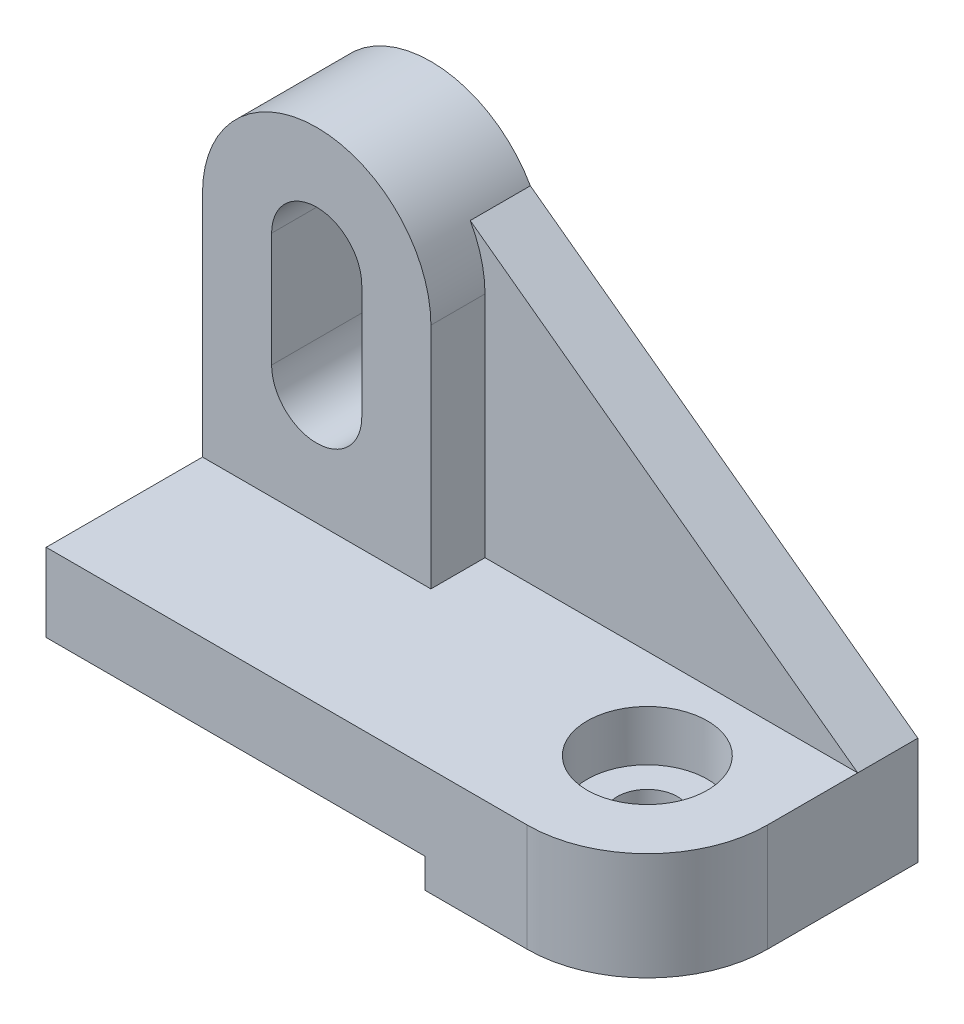
ISO-10303-21;
HEADER;
FILE_DESCRIPTION(('STEP AP214'),'2;1');
FILE_NAME('part.step','',(''),(''),'','','');
FILE_SCHEMA(('AUTOMOTIVE_DESIGN { 1 0 10303 214 1 1 1 1 }'));
ENDSEC;
DATA;
#1=APPLICATION_CONTEXT('core data for automotive mechanical design processes');
#2=APPLICATION_PROTOCOL_DEFINITION('international standard','automotive_design',2000,#1);
#3=PRODUCT_CONTEXT('',#1,'mechanical');
#4=PRODUCT('Part','Part','',(#3));
#5=PRODUCT_RELATED_PRODUCT_CATEGORY('part','',(#4));
#6=PRODUCT_DEFINITION_FORMATION('','',#4);
#7=PRODUCT_DEFINITION_CONTEXT('part definition',#1,'design');
#8=PRODUCT_DEFINITION('design','',#6,#7);
#9=PRODUCT_DEFINITION_SHAPE('','',#8);
#10=(LENGTH_UNIT() NAMED_UNIT(*) SI_UNIT(.MILLI.,.METRE.));
#11=(NAMED_UNIT(*) PLANE_ANGLE_UNIT() SI_UNIT($,.RADIAN.));
#12=(NAMED_UNIT(*) SI_UNIT($,.STERADIAN.) SOLID_ANGLE_UNIT());
#13=UNCERTAINTY_MEASURE_WITH_UNIT(LENGTH_MEASURE(1.E-05),#10,'distance_accuracy_value','');
#14=(GEOMETRIC_REPRESENTATION_CONTEXT(3) GLOBAL_UNCERTAINTY_ASSIGNED_CONTEXT((#13)) GLOBAL_UNIT_ASSIGNED_CONTEXT((#10,
#11,#12)) REPRESENTATION_CONTEXT('',''));
#15=CARTESIAN_POINT('',(0.,0.,0.));
#16=DIRECTION('',(0.,0.,1.));
#17=DIRECTION('',(1.,0.,0.));
#18=AXIS2_PLACEMENT_3D('',#15,#16,#17);
#19=CARTESIAN_POINT('',(26.127941661392,-4.90948585690516,-20.));
#20=DIRECTION('',(0.,1.,0.));
#21=DIRECTION('',(0.,0.,1.));
#22=AXIS2_PLACEMENT_3D('',#19,#20,#21);
#23=CYLINDRICAL_SURFACE('',#22,10.);
#24=CARTESIAN_POINT('',(26.127941661392,13.,-20.));
#25=DIRECTION('',(0.,1.,0.));
#26=DIRECTION('',(0.,0.,1.));
#27=AXIS2_PLACEMENT_3D('',#24,#25,#26);
#28=CIRCLE('',#27,10.);
#29=CARTESIAN_POINT('',(26.127941661392,13.,-10.));
#30=VERTEX_POINT('',#29);
#31=EDGE_CURVE('E276',#30,#30,#28,.T.);
#32=ORIENTED_EDGE('',*,*,#31,.T.);
#33=EDGE_LOOP('',(#32));
#34=FACE_BOUND('',#33,.T.);
#35=CARTESIAN_POINT('',(26.127941661392,4.59151414309485,-20.));
#36=DIRECTION('',(0.,-1.,0.));
#37=DIRECTION('',(1.,0.,0.));
#38=AXIS2_PLACEMENT_3D('',#35,#36,#37);
#39=CIRCLE('',#38,10.);
#40=CARTESIAN_POINT('',(36.127941661392,4.59151414309484,-20.));
#41=VERTEX_POINT('',#40);
#42=EDGE_CURVE('E11',#41,#41,#39,.F.);
#43=ORIENTED_EDGE('',*,*,#42,.F.);
#44=EDGE_LOOP('',(#43));
#45=FACE_BOUND('',#44,.T.);
#46=ADVANCED_FACE('F37',(#34,#45),#23,.F.);
#47=CARTESIAN_POINT('',(-34.8720583386081,51.,-26.));
#48=DIRECTION('',(0.,0.,-1.));
#49=DIRECTION('',(-1.,0.,0.));
#50=AXIS2_PLACEMENT_3D('',#47,#48,#49);
#51=CYLINDRICAL_SURFACE('',#50,19.);
#52=CARTESIAN_POINT('',(-34.8720583386081,51.,-35.));
#53=DIRECTION('',(0.,0.,1.));
#54=DIRECTION('',(1.,0.,0.));
#55=AXIS2_PLACEMENT_3D('',#52,#53,#54);
#56=CIRCLE('',#55,19.);
#57=CARTESIAN_POINT('',(-18.3294113453158,60.3456316242039,-35.));
#58=VERTEX_POINT('',#57);
#59=CARTESIAN_POINT('',(-15.8720583386081,51.,-35.));
#60=VERTEX_POINT('',#59);
#61=EDGE_CURVE('E45',#58,#60,#56,.F.);
#62=ORIENTED_EDGE('',*,*,#61,.F.);
#63=DIRECTION('',(0.,0.,-1.));
#64=VECTOR('',#63,1.);
#65=CARTESIAN_POINT('',(-18.3294113453158,60.3456316242039,-35.));
#66=LINE('',#65,#64);
#67=CARTESIAN_POINT('',(-18.3294113453158,60.3456316242039,-45.));
#68=VERTEX_POINT('',#67);
#69=EDGE_CURVE('E159',#58,#68,#66,.T.);
#70=ORIENTED_EDGE('',*,*,#69,.T.);
#71=CARTESIAN_POINT('',(-34.8720583386081,51.,-45.));
#72=DIRECTION('',(0.,0.,-1.));
#73=DIRECTION('',(-1.,0.,0.));
#74=AXIS2_PLACEMENT_3D('',#71,#72,#73);
#75=CIRCLE('',#74,19.);
#76=CARTESIAN_POINT('',(-53.8720583386081,51.,-45.));
#77=VERTEX_POINT('',#76);
#78=EDGE_CURVE('E233',#77,#68,#75,.T.);
#79=ORIENTED_EDGE('',*,*,#78,.F.);
#80=DIRECTION('',(0.,0.,-1.));
#81=VECTOR('',#80,1.);
#82=CARTESIAN_POINT('',(-53.8720583386081,51.,-26.));
#83=LINE('',#82,#81);
#84=CARTESIAN_POINT('',(-53.8720583386081,51.,-26.));
#85=VERTEX_POINT('',#84);
#86=EDGE_CURVE('E226',#85,#77,#83,.T.);
#87=ORIENTED_EDGE('',*,*,#86,.F.);
#88=CARTESIAN_POINT('',(-34.8720583386081,51.,-26.));
#89=DIRECTION('',(0.,0.,-1.));
#90=DIRECTION('',(-1.,0.,0.));
#91=AXIS2_PLACEMENT_3D('',#88,#89,#90);
#92=CIRCLE('',#91,19.);
#93=CARTESIAN_POINT('',(-15.8720583386081,51.,-26.));
#94=VERTEX_POINT('',#93);
#95=EDGE_CURVE('E239',#85,#94,#92,.T.);
#96=ORIENTED_EDGE('',*,*,#95,.T.);
#97=DIRECTION('',(0.,0.,-1.));
#98=VECTOR('',#97,1.);
#99=CARTESIAN_POINT('',(-15.8720583386081,51.,-26.));
#100=LINE('',#99,#98);
#101=EDGE_CURVE('E170',#94,#60,#100,.T.);
#102=ORIENTED_EDGE('',*,*,#101,.T.);
#103=EDGE_LOOP('',(#62,#70,#79,#87,#96,#102));
#104=FACE_BOUND('',#103,.T.);
#105=ADVANCED_FACE('F168',(#104),#51,.T.);
#106=CARTESIAN_POINT('',(9.12794166139195,0.,-45.));
#107=DIRECTION('',(0.,-1.,0.));
#108=DIRECTION('',(1.,0.,0.));
#109=AXIS2_PLACEMENT_3D('',#106,#107,#108);
#110=PLANE('',#109);
#111=DIRECTION('',(1.,0.,0.));
#112=VECTOR('',#111,1.);
#113=CARTESIAN_POINT('',(9.12794166139195,0.,0.));
#114=LINE('',#113,#112);
#115=CARTESIAN_POINT('',(-53.872058338608,0.,0.));
#116=VERTEX_POINT('',#115);
#117=CARTESIAN_POINT('',(9.12794166139195,0.,0.));
#118=VERTEX_POINT('',#117);
#119=EDGE_CURVE('E209',#116,#118,#114,.T.);
#120=ORIENTED_EDGE('',*,*,#119,.F.);
#121=DIRECTION('',(0.,0.,1.));
#122=VECTOR('',#121,1.);
#123=CARTESIAN_POINT('',(-53.872058338608,0.,-45.));
#124=LINE('',#123,#122);
#125=CARTESIAN_POINT('',(-53.872058338608,0.,-45.));
#126=VERTEX_POINT('',#125);
#127=EDGE_CURVE('E181',#126,#116,#124,.T.);
#128=ORIENTED_EDGE('',*,*,#127,.F.);
#129=DIRECTION('',(1.,0.,0.));
#130=VECTOR('',#129,1.);
#131=CARTESIAN_POINT('',(9.12794166139195,0.,-45.));
#132=LINE('',#131,#130);
#133=CARTESIAN_POINT('',(9.12794166139195,0.,-45.));
#134=VERTEX_POINT('',#133);
#135=EDGE_CURVE('E199',#126,#134,#132,.T.);
#136=ORIENTED_EDGE('',*,*,#135,.T.);
#137=DIRECTION('',(0.,0.,1.));
#138=VECTOR('',#137,1.);
#139=CARTESIAN_POINT('',(9.12794166139195,0.,-45.));
#140=LINE('',#139,#138);
#141=EDGE_CURVE('E182',#134,#118,#140,.T.);
#142=ORIENTED_EDGE('',*,*,#141,.T.);
#143=EDGE_LOOP('',(#120,#128,#136,#142));
#144=FACE_BOUND('',#143,.T.);
#145=ADVANCED_FACE('F317',(#144),#110,.T.);
#146=CARTESIAN_POINT('',(-53.872058338608,0.,-45.));
#147=DIRECTION('',(-1.,0.,0.));
#148=DIRECTION('',(0.,0.,1.));
#149=AXIS2_PLACEMENT_3D('',#146,#147,#148);
#150=PLANE('',#149);
#151=DIRECTION('',(0.,-1.,0.));
#152=VECTOR('',#151,1.);
#153=CARTESIAN_POINT('',(-53.872058338608,0.,0.));
#154=LINE('',#153,#152);
#155=CARTESIAN_POINT('',(-53.872058338608,13.,0.));
#156=VERTEX_POINT('',#155);
#157=EDGE_CURVE('E196',#156,#116,#154,.T.);
#158=ORIENTED_EDGE('',*,*,#157,.F.);
#159=DIRECTION('',(0.,0.,1.));
#160=VECTOR('',#159,1.);
#161=CARTESIAN_POINT('',(-53.872058338608,13.,-45.));
#162=LINE('',#161,#160);
#163=CARTESIAN_POINT('',(-53.872058338608,13.,-26.));
#164=VERTEX_POINT('',#163);
#165=EDGE_CURVE('E193',#164,#156,#162,.T.);
#166=ORIENTED_EDGE('',*,*,#165,.F.);
#167=DIRECTION('',(0.,1.,0.));
#168=VECTOR('',#167,1.);
#169=CARTESIAN_POINT('',(-53.872058338608,13.,-26.));
#170=LINE('',#169,#168);
#171=EDGE_CURVE('E52',#164,#85,#170,.T.);
#172=ORIENTED_EDGE('',*,*,#171,.T.);
#173=ORIENTED_EDGE('',*,*,#86,.T.);
#174=DIRECTION('',(0.,-1.,0.));
#175=VECTOR('',#174,1.);
#176=CARTESIAN_POINT('',(-53.872058338608,0.,-45.));
#177=LINE('',#176,#175);
#178=EDGE_CURVE('E185',#77,#126,#177,.T.);
#179=ORIENTED_EDGE('',*,*,#178,.T.);
#180=ORIENTED_EDGE('',*,*,#127,.T.);
#181=EDGE_LOOP('',(#158,#166,#172,#173,#179,#180));
#182=FACE_BOUND('',#181,.T.);
#183=ADVANCED_FACE('F357',(#182),#150,.T.);
#184=CARTESIAN_POINT('',(-53.872058338608,13.,-45.));
#185=DIRECTION('',(0.,1.,0.));
#186=DIRECTION('',(0.,0.,1.));
#187=AXIS2_PLACEMENT_3D('',#184,#185,#186);
#188=PLANE('',#187);
#189=ORIENTED_EDGE('',*,*,#31,.F.);
#190=EDGE_LOOP('',(#189));
#191=FACE_BOUND('',#190,.T.);
#192=DIRECTION('',(1.,0.,0.));
#193=VECTOR('',#192,1.);
#194=CARTESIAN_POINT('',(-18.3294113453158,13.,-35.));
#195=LINE('',#194,#193);
#196=CARTESIAN_POINT('',(-15.8720583386081,13.,-35.));
#197=VERTEX_POINT('',#196);
#198=CARTESIAN_POINT('',(46.127941661392,13.,-35.));
#199=VERTEX_POINT('',#198);
#200=EDGE_CURVE('E153',#197,#199,#195,.T.);
#201=ORIENTED_EDGE('',*,*,#200,.F.);
#202=DIRECTION('',(0.,0.,-1.));
#203=VECTOR('',#202,1.);
#204=CARTESIAN_POINT('',(-15.8720583386081,13.,-26.));
#205=LINE('',#204,#203);
#206=CARTESIAN_POINT('',(-15.8720583386081,13.,-26.));
#207=VERTEX_POINT('',#206);
#208=EDGE_CURVE('E212',#207,#197,#205,.T.);
#209=ORIENTED_EDGE('',*,*,#208,.F.);
#210=DIRECTION('',(-1.,0.,0.));
#211=VECTOR('',#210,1.);
#212=CARTESIAN_POINT('',(-53.872058338608,13.,-26.));
#213=LINE('',#212,#211);
#214=EDGE_CURVE('E235',#207,#164,#213,.T.);
#215=ORIENTED_EDGE('',*,*,#214,.T.);
#216=ORIENTED_EDGE('',*,*,#165,.T.);
#217=DIRECTION('',(-1.,0.,0.));
#218=VECTOR('',#217,1.);
#219=CARTESIAN_POINT('',(-53.872058338608,13.,0.));
#220=LINE('',#219,#218);
#221=CARTESIAN_POINT('',(26.127941661392,13.,0.));
#222=VERTEX_POINT('',#221);
#223=EDGE_CURVE('E200',#222,#156,#220,.T.);
#224=ORIENTED_EDGE('',*,*,#223,.F.);
#225=CARTESIAN_POINT('',(26.127941661392,13.,-20.));
#226=DIRECTION('',(0.,1.,0.));
#227=DIRECTION('',(0.,0.,1.));
#228=AXIS2_PLACEMENT_3D('',#225,#226,#227);
#229=CIRCLE('',#228,20.);
#230=CARTESIAN_POINT('',(46.127941661392,13.,-20.));
#231=VERTEX_POINT('',#230);
#232=EDGE_CURVE('E175',#222,#231,#229,.T.);
#233=ORIENTED_EDGE('',*,*,#232,.T.);
#234=DIRECTION('',(0.,0.,1.));
#235=VECTOR('',#234,1.);
#236=CARTESIAN_POINT('',(46.127941661392,13.,-45.));
#237=LINE('',#236,#235);
#238=EDGE_CURVE('E189',#199,#231,#237,.T.);
#239=ORIENTED_EDGE('',*,*,#238,.F.);
#240=EDGE_LOOP('',(#201,#209,#215,#216,#224,#233,#239));
#241=FACE_BOUND('',#240,.T.);
#242=ADVANCED_FACE('F309',(#191,#241),#188,.T.);
#243=CARTESIAN_POINT('',(46.127941661392,13.,-45.));
#244=DIRECTION('',(1.,0.,0.));
#245=DIRECTION('',(0.,0.,-1.));
#246=AXIS2_PLACEMENT_3D('',#243,#244,#245);
#247=PLANE('',#246);
#248=CARTESIAN_POINT('',(46.127941661392,13.,-45.));
#249=VERTEX_POINT('',#248);
#250=EDGE_CURVE('E190',#249,#199,#237,.T.);
#251=ORIENTED_EDGE('',*,*,#250,.T.);
#252=ORIENTED_EDGE('',*,*,#238,.T.);
#253=DIRECTION('',(0.,1.,0.));
#254=VECTOR('',#253,1.);
#255=CARTESIAN_POINT('',(46.127941661392,-4.90848585690516,-20.));
#256=LINE('',#255,#254);
#257=CARTESIAN_POINT('',(46.127941661392,-4.90848585690516,-20.));
#258=VERTEX_POINT('',#257);
#259=EDGE_CURVE('E60',#231,#258,#256,.F.);
#260=ORIENTED_EDGE('',*,*,#259,.T.);
#261=DIRECTION('',(0.,0.,1.));
#262=VECTOR('',#261,1.);
#263=CARTESIAN_POINT('',(46.127941661392,-4.90848585690516,-45.));
#264=LINE('',#263,#262);
#265=CARTESIAN_POINT('',(46.127941661392,-4.90848585690516,-45.));
#266=VERTEX_POINT('',#265);
#267=EDGE_CURVE('E187',#266,#258,#264,.T.);
#268=ORIENTED_EDGE('',*,*,#267,.F.);
#269=DIRECTION('',(0.,1.,0.));
#270=VECTOR('',#269,1.);
#271=CARTESIAN_POINT('',(46.127941661392,13.,-45.));
#272=LINE('',#271,#270);
#273=EDGE_CURVE('E215',#266,#249,#272,.T.);
#274=ORIENTED_EDGE('',*,*,#273,.T.);
#275=EDGE_LOOP('',(#251,#252,#260,#268,#274));
#276=FACE_BOUND('',#275,.T.);
#277=ADVANCED_FACE('F299',(#276),#247,.T.);
#278=CARTESIAN_POINT('',(46.127941661392,-4.90848585690516,-45.));
#279=DIRECTION('',(0.,-1.,0.));
#280=DIRECTION('',(1.,0.,0.));
#281=AXIS2_PLACEMENT_3D('',#278,#279,#280);
#282=PLANE('',#281);
#283=ORIENTED_EDGE('',*,*,#267,.T.);
#284=CARTESIAN_POINT('',(26.127941661392,-4.90848585690515,-20.));
#285=DIRECTION('',(0.,-1.,0.));
#286=DIRECTION('',(1.,0.,0.));
#287=AXIS2_PLACEMENT_3D('',#284,#285,#286);
#288=CIRCLE('',#287,20.);
#289=CARTESIAN_POINT('',(26.127941661392,-4.90848585690515,0.));
#290=VERTEX_POINT('',#289);
#291=EDGE_CURVE('E171',#258,#290,#288,.T.);
#292=ORIENTED_EDGE('',*,*,#291,.T.);
#293=DIRECTION('',(1.,0.,0.));
#294=VECTOR('',#293,1.);
#295=CARTESIAN_POINT('',(46.127941661392,-4.90848585690516,0.));
#296=LINE('',#295,#294);
#297=CARTESIAN_POINT('',(9.12794166139195,-4.90848585690514,0.));
#298=VERTEX_POINT('',#297);
#299=EDGE_CURVE('E203',#298,#290,#296,.T.);
#300=ORIENTED_EDGE('',*,*,#299,.F.);
#301=DIRECTION('',(0.,0.,1.));
#302=VECTOR('',#301,1.);
#303=CARTESIAN_POINT('',(9.12794166139195,-4.90848585690514,-45.));
#304=LINE('',#303,#302);
#305=CARTESIAN_POINT('',(9.12794166139195,-4.90848585690514,-45.));
#306=VERTEX_POINT('',#305);
#307=EDGE_CURVE('E184',#306,#298,#304,.T.);
#308=ORIENTED_EDGE('',*,*,#307,.F.);
#309=DIRECTION('',(1.,0.,0.));
#310=VECTOR('',#309,1.);
#311=CARTESIAN_POINT('',(46.127941661392,-4.90848585690516,-45.));
#312=LINE('',#311,#310);
#313=EDGE_CURVE('E218',#306,#266,#312,.T.);
#314=ORIENTED_EDGE('',*,*,#313,.T.);
#315=EDGE_LOOP('',(#283,#292,#300,#308,#314));
#316=FACE_BOUND('',#315,.T.);
#317=CARTESIAN_POINT('',(26.127941661392,-4.90848585690515,-20.));
#318=DIRECTION('',(0.,-1.,0.));
#319=DIRECTION('',(1.,0.,0.));
#320=AXIS2_PLACEMENT_3D('',#317,#318,#319);
#321=CIRCLE('',#320,5.);
#322=CARTESIAN_POINT('',(31.127941661392,-4.90848585690515,-20.));
#323=VERTEX_POINT('',#322);
#324=EDGE_CURVE('E281',#323,#323,#321,.T.);
#325=ORIENTED_EDGE('',*,*,#324,.F.);
#326=EDGE_LOOP('',(#325));
#327=FACE_BOUND('',#326,.T.);
#328=ADVANCED_FACE('F296',(#316,#327),#282,.T.);
#329=CARTESIAN_POINT('',(9.12794166139195,-4.90848585690514,-45.));
#330=DIRECTION('',(-1.,0.,0.));
#331=DIRECTION('',(0.,0.,1.));
#332=AXIS2_PLACEMENT_3D('',#329,#330,#331);
#333=PLANE('',#332);
#334=DIRECTION('',(0.,-1.,0.));
#335=VECTOR('',#334,1.);
#336=CARTESIAN_POINT('',(9.12794166139195,-4.90848585690514,0.));
#337=LINE('',#336,#335);
#338=EDGE_CURVE('E206',#118,#298,#337,.T.);
#339=ORIENTED_EDGE('',*,*,#338,.F.);
#340=ORIENTED_EDGE('',*,*,#141,.F.);
#341=DIRECTION('',(0.,-1.,0.));
#342=VECTOR('',#341,1.);
#343=CARTESIAN_POINT('',(9.12794166139195,-4.90848585690514,-45.));
#344=LINE('',#343,#342);
#345=EDGE_CURVE('E221',#134,#306,#344,.T.);
#346=ORIENTED_EDGE('',*,*,#345,.T.);
#347=ORIENTED_EDGE('',*,*,#307,.T.);
#348=EDGE_LOOP('',(#339,#340,#346,#347));
#349=FACE_BOUND('',#348,.T.);
#350=ADVANCED_FACE('F298',(#349),#333,.T.);
#351=CARTESIAN_POINT('',(0.,0.,-45.));
#352=DIRECTION('',(0.,0.,-1.));
#353=DIRECTION('',(-1.,0.,0.));
#354=AXIS2_PLACEMENT_3D('',#351,#352,#353);
#355=PLANE('',#354);
#356=DIRECTION('',(-0.80594618711082,0.591988803510278,0.));
#357=VECTOR('',#356,1.);
#358=CARTESIAN_POINT('',(46.127941661392,13.,-45.));
#359=LINE('',#358,#357);
#360=EDGE_CURVE('E156',#249,#68,#359,.T.);
#361=ORIENTED_EDGE('',*,*,#360,.F.);
#362=ORIENTED_EDGE('',*,*,#273,.F.);
#363=ORIENTED_EDGE('',*,*,#313,.F.);
#364=ORIENTED_EDGE('',*,*,#345,.F.);
#365=ORIENTED_EDGE('',*,*,#135,.F.);
#366=ORIENTED_EDGE('',*,*,#178,.F.);
#367=ORIENTED_EDGE('',*,*,#78,.T.);
#368=EDGE_LOOP('',(#361,#362,#363,#364,#365,#366,#367));
#369=FACE_BOUND('',#368,.T.);
#370=CARTESIAN_POINT('',(-34.8720583386081,51.,-45.));
#371=DIRECTION('',(0.,0.,-1.));
#372=DIRECTION('',(-1.,0.,0.));
#373=AXIS2_PLACEMENT_3D('',#370,#371,#372);
#374=CIRCLE('',#373,7.49999999999999);
#375=CARTESIAN_POINT('',(-42.372058338608,51.,-45.));
#376=VERTEX_POINT('',#375);
#377=CARTESIAN_POINT('',(-27.3720583386081,51.,-45.));
#378=VERTEX_POINT('',#377);
#379=EDGE_CURVE('E262',#376,#378,#374,.T.);
#380=ORIENTED_EDGE('',*,*,#379,.F.);
#381=DIRECTION('',(0.,1.,0.));
#382=VECTOR('',#381,1.);
#383=CARTESIAN_POINT('',(-42.372058338608,51.,-45.));
#384=LINE('',#383,#382);
#385=CARTESIAN_POINT('',(-42.372058338608,32.,-45.));
#386=VERTEX_POINT('',#385);
#387=EDGE_CURVE('E252',#386,#376,#384,.T.);
#388=ORIENTED_EDGE('',*,*,#387,.F.);
#389=CARTESIAN_POINT('',(-34.8720583386081,32.,-45.));
#390=DIRECTION('',(0.,0.,-1.));
#391=DIRECTION('',(-1.,0.,0.));
#392=AXIS2_PLACEMENT_3D('',#389,#390,#391);
#393=CIRCLE('',#392,7.49999999999999);
#394=CARTESIAN_POINT('',(-27.3720583386081,32.,-45.));
#395=VERTEX_POINT('',#394);
#396=EDGE_CURVE('E256',#395,#386,#393,.T.);
#397=ORIENTED_EDGE('',*,*,#396,.F.);
#398=DIRECTION('',(0.,-1.,0.));
#399=VECTOR('',#398,1.);
#400=CARTESIAN_POINT('',(-27.3720583386081,51.,-45.));
#401=LINE('',#400,#399);
#402=EDGE_CURVE('E259',#378,#395,#401,.T.);
#403=ORIENTED_EDGE('',*,*,#402,.F.);
#404=EDGE_LOOP('',(#380,#388,#397,#403));
#405=FACE_BOUND('',#404,.T.);
#406=ADVANCED_FACE('F306',(#369,#405),#355,.T.);
#407=CARTESIAN_POINT('',(0.,0.,0.));
#408=DIRECTION('',(0.,0.,-1.));
#409=DIRECTION('',(-1.,0.,0.));
#410=AXIS2_PLACEMENT_3D('',#407,#408,#409);
#411=PLANE('',#410);
#412=ORIENTED_EDGE('',*,*,#299,.T.);
#413=DIRECTION('',(0.,1.,0.));
#414=VECTOR('',#413,1.);
#415=CARTESIAN_POINT('',(26.127941661392,13.,0.));
#416=LINE('',#415,#414);
#417=EDGE_CURVE('E178',#290,#222,#416,.T.);
#418=ORIENTED_EDGE('',*,*,#417,.T.);
#419=ORIENTED_EDGE('',*,*,#223,.T.);
#420=ORIENTED_EDGE('',*,*,#157,.T.);
#421=ORIENTED_EDGE('',*,*,#119,.T.);
#422=ORIENTED_EDGE('',*,*,#338,.T.);
#423=EDGE_LOOP('',(#412,#418,#419,#420,#421,#422));
#424=FACE_BOUND('',#423,.T.);
#425=ADVANCED_FACE('F352',(#424),#411,.F.);
#426=CARTESIAN_POINT('',(26.127941661392,0.,-20.));
#427=DIRECTION('',(0.,-1.,0.));
#428=DIRECTION('',(0.,0.,-1.));
#429=AXIS2_PLACEMENT_3D('',#426,#427,#428);
#430=CYLINDRICAL_SURFACE('',#429,20.);
#431=ORIENTED_EDGE('',*,*,#291,.F.);
#432=ORIENTED_EDGE('',*,*,#259,.F.);
#433=ORIENTED_EDGE('',*,*,#232,.F.);
#434=ORIENTED_EDGE('',*,*,#417,.F.);
#435=EDGE_LOOP('',(#431,#432,#433,#434));
#436=FACE_BOUND('',#435,.T.);
#437=ADVANCED_FACE('F39',(#436),#430,.T.);
#438=CARTESIAN_POINT('',(-15.8720583386081,13.,-26.));
#439=DIRECTION('',(1.,0.,0.));
#440=DIRECTION('',(0.,1.,0.));
#441=AXIS2_PLACEMENT_3D('',#438,#439,#440);
#442=PLANE('',#441);
#443=DIRECTION('',(0.,-1.,0.));
#444=VECTOR('',#443,1.);
#445=CARTESIAN_POINT('',(-15.8720583386081,13.,-35.));
#446=LINE('',#445,#444);
#447=EDGE_CURVE('E165',#60,#197,#446,.T.);
#448=ORIENTED_EDGE('',*,*,#447,.F.);
#449=ORIENTED_EDGE('',*,*,#101,.F.);
#450=DIRECTION('',(0.,-1.,0.));
#451=VECTOR('',#450,1.);
#452=CARTESIAN_POINT('',(-15.8720583386081,13.,-26.));
#453=LINE('',#452,#451);
#454=EDGE_CURVE('E229',#94,#207,#453,.T.);
#455=ORIENTED_EDGE('',*,*,#454,.T.);
#456=ORIENTED_EDGE('',*,*,#208,.T.);
#457=EDGE_LOOP('',(#448,#449,#455,#456));
#458=FACE_BOUND('',#457,.T.);
#459=ADVANCED_FACE('F345',(#458),#442,.T.);
#460=CARTESIAN_POINT('',(-34.8720583386081,51.,-26.));
#461=DIRECTION('',(0.,0.,-1.));
#462=DIRECTION('',(-1.,0.,0.));
#463=AXIS2_PLACEMENT_3D('',#460,#461,#462);
#464=PLANE('',#463);
#465=DIRECTION('',(0.,1.,0.));
#466=VECTOR('',#465,1.);
#467=CARTESIAN_POINT('',(-42.372058338608,51.,-26.));
#468=LINE('',#467,#466);
#469=CARTESIAN_POINT('',(-42.372058338608,32.,-26.));
#470=VERTEX_POINT('',#469);
#471=CARTESIAN_POINT('',(-42.372058338608,51.,-26.));
#472=VERTEX_POINT('',#471);
#473=EDGE_CURVE('E247',#470,#472,#468,.T.);
#474=ORIENTED_EDGE('',*,*,#473,.T.);
#475=CARTESIAN_POINT('',(-34.8720583386081,51.,-26.));
#476=DIRECTION('',(0.,0.,-1.));
#477=DIRECTION('',(-1.,0.,0.));
#478=AXIS2_PLACEMENT_3D('',#475,#476,#477);
#479=CIRCLE('',#478,7.49999999999999);
#480=CARTESIAN_POINT('',(-27.3720583386081,51.,-26.));
#481=VERTEX_POINT('',#480);
#482=EDGE_CURVE('E255',#472,#481,#479,.T.);
#483=ORIENTED_EDGE('',*,*,#482,.T.);
#484=DIRECTION('',(0.,-1.,0.));
#485=VECTOR('',#484,1.);
#486=CARTESIAN_POINT('',(-27.3720583386081,51.,-26.));
#487=LINE('',#486,#485);
#488=CARTESIAN_POINT('',(-27.3720583386081,32.,-26.));
#489=VERTEX_POINT('',#488);
#490=EDGE_CURVE('E269',#481,#489,#487,.T.);
#491=ORIENTED_EDGE('',*,*,#490,.T.);
#492=CARTESIAN_POINT('',(-34.8720583386081,32.,-26.));
#493=DIRECTION('',(0.,0.,-1.));
#494=DIRECTION('',(-1.,0.,0.));
#495=AXIS2_PLACEMENT_3D('',#492,#493,#494);
#496=CIRCLE('',#495,7.49999999999999);
#497=EDGE_CURVE('E266',#489,#470,#496,.T.);
#498=ORIENTED_EDGE('',*,*,#497,.T.);
#499=EDGE_LOOP('',(#474,#483,#491,#498));
#500=FACE_BOUND('',#499,.T.);
#501=ORIENTED_EDGE('',*,*,#214,.F.);
#502=ORIENTED_EDGE('',*,*,#454,.F.);
#503=ORIENTED_EDGE('',*,*,#95,.F.);
#504=ORIENTED_EDGE('',*,*,#171,.F.);
#505=EDGE_LOOP('',(#501,#502,#503,#504));
#506=FACE_BOUND('',#505,.T.);
#507=ADVANCED_FACE('F341',(#500,#506),#464,.F.);
#508=CARTESIAN_POINT('',(-34.8720583386081,51.,-26.));
#509=DIRECTION('',(0.,0.,-1.));
#510=DIRECTION('',(-1.,0.,0.));
#511=AXIS2_PLACEMENT_3D('',#508,#509,#510);
#512=CYLINDRICAL_SURFACE('',#511,7.49999999999999);
#513=ORIENTED_EDGE('',*,*,#379,.T.);
#514=DIRECTION('',(0.,0.,-1.));
#515=VECTOR('',#514,1.);
#516=CARTESIAN_POINT('',(-27.3720583386081,51.,-26.));
#517=LINE('',#516,#515);
#518=EDGE_CURVE('E243',#481,#378,#517,.T.);
#519=ORIENTED_EDGE('',*,*,#518,.F.);
#520=ORIENTED_EDGE('',*,*,#482,.F.);
#521=DIRECTION('',(0.,0.,-1.));
#522=VECTOR('',#521,1.);
#523=CARTESIAN_POINT('',(-42.372058338608,51.,-26.));
#524=LINE('',#523,#522);
#525=EDGE_CURVE('E236',#472,#376,#524,.T.);
#526=ORIENTED_EDGE('',*,*,#525,.T.);
#527=EDGE_LOOP('',(#513,#519,#520,#526));
#528=FACE_BOUND('',#527,.T.);
#529=ADVANCED_FACE('F331',(#528),#512,.F.);
#530=CARTESIAN_POINT('',(-42.372058338608,51.,-26.));
#531=DIRECTION('',(-1.,0.,0.));
#532=DIRECTION('',(0.,0.,1.));
#533=AXIS2_PLACEMENT_3D('',#530,#531,#532);
#534=PLANE('',#533);
#535=ORIENTED_EDGE('',*,*,#387,.T.);
#536=ORIENTED_EDGE('',*,*,#525,.F.);
#537=ORIENTED_EDGE('',*,*,#473,.F.);
#538=DIRECTION('',(0.,0.,-1.));
#539=VECTOR('',#538,1.);
#540=CARTESIAN_POINT('',(-42.372058338608,32.,-26.));
#541=LINE('',#540,#539);
#542=EDGE_CURVE('E249',#470,#386,#541,.T.);
#543=ORIENTED_EDGE('',*,*,#542,.T.);
#544=EDGE_LOOP('',(#535,#536,#537,#543));
#545=FACE_BOUND('',#544,.T.);
#546=ADVANCED_FACE('F327',(#545),#534,.F.);
#547=CARTESIAN_POINT('',(-34.8720583386081,32.,-26.));
#548=DIRECTION('',(0.,0.,-1.));
#549=DIRECTION('',(-1.,0.,0.));
#550=AXIS2_PLACEMENT_3D('',#547,#548,#549);
#551=CYLINDRICAL_SURFACE('',#550,7.49999999999999);
#552=ORIENTED_EDGE('',*,*,#396,.T.);
#553=ORIENTED_EDGE('',*,*,#542,.F.);
#554=ORIENTED_EDGE('',*,*,#497,.F.);
#555=DIRECTION('',(0.,0.,-1.));
#556=VECTOR('',#555,1.);
#557=CARTESIAN_POINT('',(-27.3720583386081,32.,-26.));
#558=LINE('',#557,#556);
#559=EDGE_CURVE('E246',#489,#395,#558,.T.);
#560=ORIENTED_EDGE('',*,*,#559,.T.);
#561=EDGE_LOOP('',(#552,#553,#554,#560));
#562=FACE_BOUND('',#561,.T.);
#563=ADVANCED_FACE('F330',(#562),#551,.F.);
#564=CARTESIAN_POINT('',(-27.3720583386081,51.,-26.));
#565=DIRECTION('',(1.,0.,0.));
#566=DIRECTION('',(0.,1.,0.));
#567=AXIS2_PLACEMENT_3D('',#564,#565,#566);
#568=PLANE('',#567);
#569=ORIENTED_EDGE('',*,*,#402,.T.);
#570=ORIENTED_EDGE('',*,*,#559,.F.);
#571=ORIENTED_EDGE('',*,*,#490,.F.);
#572=ORIENTED_EDGE('',*,*,#518,.T.);
#573=EDGE_LOOP('',(#569,#570,#571,#572));
#574=FACE_BOUND('',#573,.T.);
#575=ADVANCED_FACE('F326',(#574),#568,.F.);
#576=CARTESIAN_POINT('',(46.127941661392,13.,-35.));
#577=DIRECTION('',(-0.591988803510278,-0.80594618711082,0.));
#578=DIRECTION('',(0.80594618711082,-0.591988803510278,0.));
#579=AXIS2_PLACEMENT_3D('',#576,#577,#578);
#580=PLANE('',#579);
#581=ORIENTED_EDGE('',*,*,#360,.T.);
#582=ORIENTED_EDGE('',*,*,#69,.F.);
#583=DIRECTION('',(-0.80594618711082,0.591988803510278,0.));
#584=VECTOR('',#583,1.);
#585=CARTESIAN_POINT('',(46.127941661392,13.,-35.));
#586=LINE('',#585,#584);
#587=EDGE_CURVE('E147',#199,#58,#586,.T.);
#588=ORIENTED_EDGE('',*,*,#587,.F.);
#589=ORIENTED_EDGE('',*,*,#250,.F.);
#590=EDGE_LOOP('',(#581,#582,#588,#589));
#591=FACE_BOUND('',#590,.T.);
#592=ADVANCED_FACE('F160',(#591),#580,.F.);
#593=CARTESIAN_POINT('',(0.,0.,-35.));
#594=DIRECTION('',(0.,0.,1.));
#595=DIRECTION('',(1.,0.,0.));
#596=AXIS2_PLACEMENT_3D('',#593,#594,#595);
#597=PLANE('',#596);
#598=ORIENTED_EDGE('',*,*,#61,.T.);
#599=ORIENTED_EDGE('',*,*,#447,.T.);
#600=ORIENTED_EDGE('',*,*,#200,.T.);
#601=ORIENTED_EDGE('',*,*,#587,.T.);
#602=EDGE_LOOP('',(#598,#599,#600,#601));
#603=FACE_BOUND('',#602,.T.);
#604=ADVANCED_FACE('F149',(#603),#597,.T.);
#605=CARTESIAN_POINT('',(26.127941661392,4.59151414309485,-20.));
#606=DIRECTION('',(0.,-1.,0.));
#607=DIRECTION('',(1.,0.,0.));
#608=AXIS2_PLACEMENT_3D('',#605,#606,#607);
#609=CYLINDRICAL_SURFACE('',#608,5.);
#610=CARTESIAN_POINT('',(26.127941661392,4.59151414309485,-20.));
#611=DIRECTION('',(0.,-1.,0.));
#612=DIRECTION('',(1.,0.,0.));
#613=AXIS2_PLACEMENT_3D('',#610,#611,#612);
#614=CIRCLE('',#613,5.);
#615=CARTESIAN_POINT('',(31.127941661392,4.59151414309485,-20.));
#616=VERTEX_POINT('',#615);
#617=EDGE_CURVE('E280',#616,#616,#614,.T.);
#618=ORIENTED_EDGE('',*,*,#617,.F.);
#619=EDGE_LOOP('',(#618));
#620=FACE_BOUND('',#619,.T.);
#621=ORIENTED_EDGE('',*,*,#324,.T.);
#622=EDGE_LOOP('',(#621));
#623=FACE_BOUND('',#622,.T.);
#624=ADVANCED_FACE('F290',(#620,#623),#609,.F.);
#625=CARTESIAN_POINT('',(0.,4.59151414309486,0.));
#626=DIRECTION('',(0.,-1.,0.));
#627=DIRECTION('',(1.,0.,0.));
#628=AXIS2_PLACEMENT_3D('',#625,#626,#627);
#629=PLANE('',#628);
#630=ORIENTED_EDGE('',*,*,#617,.T.);
#631=EDGE_LOOP('',(#630));
#632=FACE_BOUND('',#631,.T.);
#633=ORIENTED_EDGE('',*,*,#42,.T.);
#634=EDGE_LOOP('',(#633));
#635=FACE_BOUND('',#634,.T.);
#636=ADVANCED_FACE('F287',(#632,#635),#629,.F.);
#637=CLOSED_SHELL('',(#46,#105,#145,#183,#242,#277,#328,#350,#406,#425,#437,#459,#507,#529,#546,
#563,#575,#592,#604,#624,#636));
#638=MANIFOLD_SOLID_BREP('B2',#637);
#639=ADVANCED_BREP_SHAPE_REPRESENTATION('',(#18,#638),#14);
#640=SHAPE_DEFINITION_REPRESENTATION(#9,#639);
ENDSEC;
END-ISO-10303-21;
